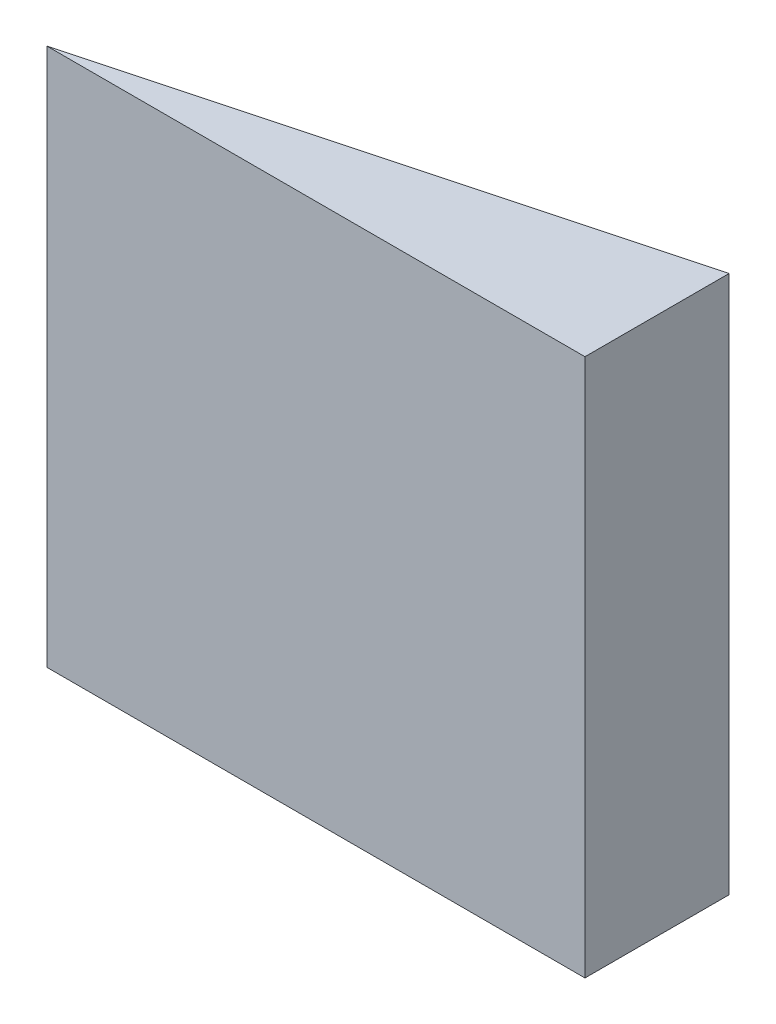
ISO-10303-21;
HEADER;
FILE_DESCRIPTION(('STEP AP214'),'2;1');
FILE_NAME('part.step','',(''),(''),'','','');
FILE_SCHEMA(('AUTOMOTIVE_DESIGN { 1 0 10303 214 1 1 1 1 }'));
ENDSEC;
DATA;
#1=APPLICATION_CONTEXT('core data for automotive mechanical design processes');
#2=APPLICATION_PROTOCOL_DEFINITION('international standard','automotive_design',2000,#1);
#3=PRODUCT_CONTEXT('',#1,'mechanical');
#4=PRODUCT('Part','Part','',(#3));
#5=PRODUCT_RELATED_PRODUCT_CATEGORY('part','',(#4));
#6=PRODUCT_DEFINITION_FORMATION('','',#4);
#7=PRODUCT_DEFINITION_CONTEXT('part definition',#1,'design');
#8=PRODUCT_DEFINITION('design','',#6,#7);
#9=PRODUCT_DEFINITION_SHAPE('','',#8);
#10=(LENGTH_UNIT() NAMED_UNIT(*) SI_UNIT(.MILLI.,.METRE.));
#11=(NAMED_UNIT(*) PLANE_ANGLE_UNIT() SI_UNIT($,.RADIAN.));
#12=(NAMED_UNIT(*) SI_UNIT($,.STERADIAN.) SOLID_ANGLE_UNIT());
#13=UNCERTAINTY_MEASURE_WITH_UNIT(LENGTH_MEASURE(1.E-05),#10,'distance_accuracy_value','');
#14=(GEOMETRIC_REPRESENTATION_CONTEXT(3) GLOBAL_UNCERTAINTY_ASSIGNED_CONTEXT((#13)) GLOBAL_UNIT_ASSIGNED_CONTEXT((#10,
#11,#12)) REPRESENTATION_CONTEXT('',''));
#15=CARTESIAN_POINT('',(0.,0.,0.));
#16=DIRECTION('',(0.,0.,1.));
#17=DIRECTION('',(1.,0.,0.));
#18=AXIS2_PLACEMENT_3D('',#15,#16,#17);
#19=CARTESIAN_POINT('',(0.,48.,0.));
#20=DIRECTION('',(0.,0.,-1.));
#21=DIRECTION('',(-1.,0.,0.));
#22=AXIS2_PLACEMENT_3D('',#19,#20,#21);
#23=PLANE('',#22);
#24=DIRECTION('',(1.,0.,0.));
#25=VECTOR('',#24,1.);
#26=CARTESIAN_POINT('',(0.,0.,0.));
#27=LINE('',#26,#25);
#28=CARTESIAN_POINT('',(0.,0.,0.));
#29=VERTEX_POINT('',#28);
#30=CARTESIAN_POINT('',(48.006,0.,0.));
#31=VERTEX_POINT('',#30);
#32=EDGE_CURVE('E82',#29,#31,#27,.T.);
#33=ORIENTED_EDGE('',*,*,#32,.T.);
#34=DIRECTION('',(0.,-1.,0.));
#35=VECTOR('',#34,1.);
#36=CARTESIAN_POINT('',(48.006,48.,0.));
#37=LINE('',#36,#35);
#38=CARTESIAN_POINT('',(48.006,48.,0.));
#39=VERTEX_POINT('',#38);
#40=EDGE_CURVE('E11',#39,#31,#37,.T.);
#41=ORIENTED_EDGE('',*,*,#40,.F.);
#42=DIRECTION('',(1.,0.,0.));
#43=VECTOR('',#42,1.);
#44=CARTESIAN_POINT('',(0.,48.,0.));
#45=LINE('',#44,#43);
#46=CARTESIAN_POINT('',(0.,48.,0.));
#47=VERTEX_POINT('',#46);
#48=EDGE_CURVE('E75',#47,#39,#45,.T.);
#49=ORIENTED_EDGE('',*,*,#48,.F.);
#50=DIRECTION('',(0.,-1.,0.));
#51=VECTOR('',#50,1.);
#52=CARTESIAN_POINT('',(0.,48.,0.));
#53=LINE('',#52,#51);
#54=EDGE_CURVE('E83',#47,#29,#53,.T.);
#55=ORIENTED_EDGE('',*,*,#54,.T.);
#56=EDGE_LOOP('',(#33,#41,#49,#55));
#57=FACE_BOUND('',#56,.T.);
#58=ADVANCED_FACE('F35',(#57),#23,.F.);
#59=CARTESIAN_POINT('',(48.006,48.,0.));
#60=DIRECTION('',(-1.,0.,0.));
#61=DIRECTION('',(0.,0.,1.));
#62=AXIS2_PLACEMENT_3D('',#59,#60,#61);
#63=PLANE('',#62);
#64=DIRECTION('',(0.,0.,-1.));
#65=VECTOR('',#64,1.);
#66=CARTESIAN_POINT('',(48.006,0.,0.));
#67=LINE('',#66,#65);
#68=CARTESIAN_POINT('',(48.006,0.,-12.8631689318481));
#69=VERTEX_POINT('',#68);
#70=EDGE_CURVE('E63',#31,#69,#67,.T.);
#71=ORIENTED_EDGE('',*,*,#70,.T.);
#72=DIRECTION('',(0.,-1.,0.));
#73=VECTOR('',#72,1.);
#74=CARTESIAN_POINT('',(48.006,48.,-12.8631689318481));
#75=LINE('',#74,#73);
#76=CARTESIAN_POINT('',(48.006,48.,-12.8631689318481));
#77=VERTEX_POINT('',#76);
#78=EDGE_CURVE('E43',#77,#69,#75,.T.);
#79=ORIENTED_EDGE('',*,*,#78,.F.);
#80=DIRECTION('',(0.,0.,-1.));
#81=VECTOR('',#80,1.);
#82=CARTESIAN_POINT('',(48.006,48.,0.));
#83=LINE('',#82,#81);
#84=EDGE_CURVE('E71',#39,#77,#83,.T.);
#85=ORIENTED_EDGE('',*,*,#84,.F.);
#86=ORIENTED_EDGE('',*,*,#40,.T.);
#87=EDGE_LOOP('',(#71,#79,#85,#86));
#88=FACE_BOUND('',#87,.T.);
#89=ADVANCED_FACE('F72',(#88),#63,.F.);
#90=CARTESIAN_POINT('',(0.,48.,0.));
#91=DIRECTION('',(0.258819045102515,0.,0.96592582628907));
#92=DIRECTION('',(0.96592582628907,0.,-0.258819045102515));
#93=AXIS2_PLACEMENT_3D('',#90,#91,#92);
#94=PLANE('',#93);
#95=DIRECTION('',(-0.96592582628907,0.,0.258819045102515));
#96=VECTOR('',#95,1.);
#97=CARTESIAN_POINT('',(0.,0.,0.));
#98=LINE('',#97,#96);
#99=EDGE_CURVE('E68',#69,#29,#98,.T.);
#100=ORIENTED_EDGE('',*,*,#99,.T.);
#101=ORIENTED_EDGE('',*,*,#54,.F.);
#102=DIRECTION('',(-0.96592582628907,0.,0.258819045102515));
#103=VECTOR('',#102,1.);
#104=CARTESIAN_POINT('',(0.,48.,0.));
#105=LINE('',#104,#103);
#106=EDGE_CURVE('E51',#77,#47,#105,.T.);
#107=ORIENTED_EDGE('',*,*,#106,.F.);
#108=ORIENTED_EDGE('',*,*,#78,.T.);
#109=EDGE_LOOP('',(#100,#101,#107,#108));
#110=FACE_BOUND('',#109,.T.);
#111=ADVANCED_FACE('F90',(#110),#94,.F.);
#112=CARTESIAN_POINT('',(0.,48.,0.));
#113=DIRECTION('',(0.,1.,0.));
#114=DIRECTION('',(0.,0.,1.));
#115=AXIS2_PLACEMENT_3D('',#112,#113,#114);
#116=PLANE('',#115);
#117=ORIENTED_EDGE('',*,*,#48,.T.);
#118=ORIENTED_EDGE('',*,*,#84,.T.);
#119=ORIENTED_EDGE('',*,*,#106,.T.);
#120=EDGE_LOOP('',(#117,#118,#119));
#121=FACE_BOUND('',#120,.T.);
#122=ADVANCED_FACE('F78',(#121),#116,.T.);
#123=CARTESIAN_POINT('',(0.,0.,0.));
#124=DIRECTION('',(0.,1.,0.));
#125=DIRECTION('',(0.,0.,1.));
#126=AXIS2_PLACEMENT_3D('',#123,#124,#125);
#127=PLANE('',#126);
#128=ORIENTED_EDGE('',*,*,#32,.F.);
#129=ORIENTED_EDGE('',*,*,#99,.F.);
#130=ORIENTED_EDGE('',*,*,#70,.F.);
#131=EDGE_LOOP('',(#128,#129,#130));
#132=FACE_BOUND('',#131,.T.);
#133=ADVANCED_FACE('F91',(#132),#127,.F.);
#134=CLOSED_SHELL('',(#58,#89,#111,#122,#133));
#135=MANIFOLD_SOLID_BREP('B2',#134);
#136=ADVANCED_BREP_SHAPE_REPRESENTATION('',(#18,#135),#14);
#137=SHAPE_DEFINITION_REPRESENTATION(#9,#136);
ENDSEC;
END-ISO-10303-21;
